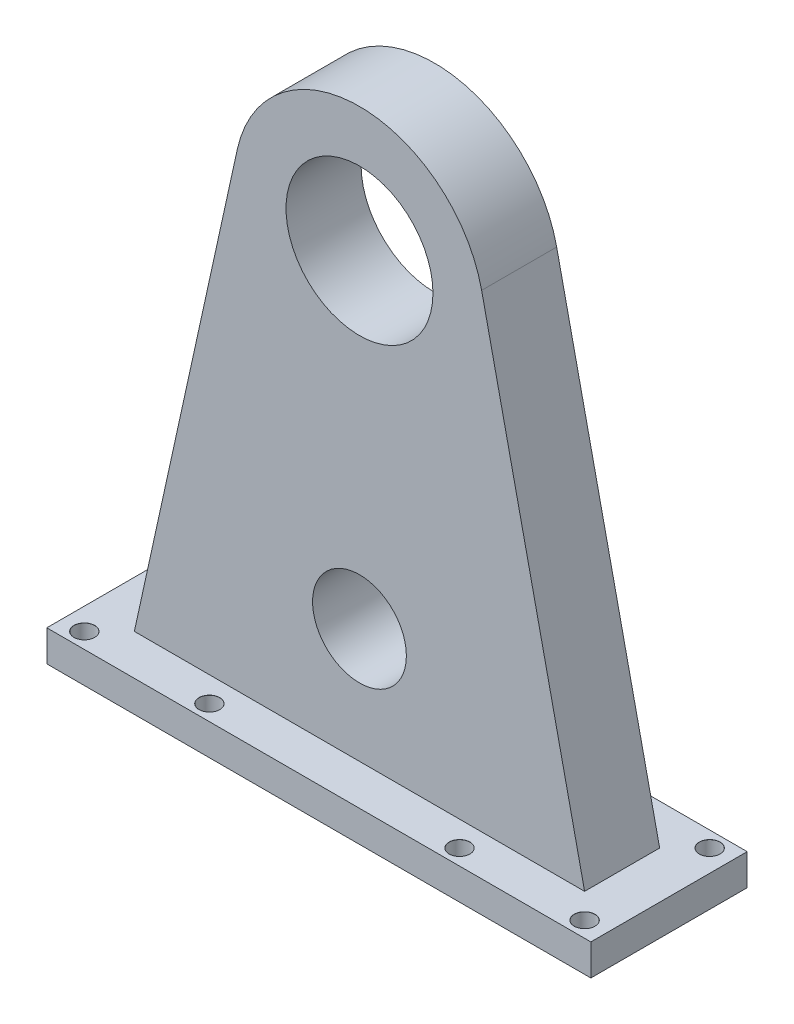
ISO-10303-21;
HEADER;
FILE_DESCRIPTION(('STEP AP214'),'2;1');
FILE_NAME('part.step','',(''),(''),'','','');
FILE_SCHEMA(('AUTOMOTIVE_DESIGN { 1 0 10303 214 1 1 1 1 }'));
ENDSEC;
DATA;
#1=APPLICATION_CONTEXT('core data for automotive mechanical design processes');
#2=APPLICATION_PROTOCOL_DEFINITION('international standard','automotive_design',2000,#1);
#3=PRODUCT_CONTEXT('',#1,'mechanical');
#4=PRODUCT('Part','Part','',(#3));
#5=PRODUCT_RELATED_PRODUCT_CATEGORY('part','',(#4));
#6=PRODUCT_DEFINITION_FORMATION('','',#4);
#7=PRODUCT_DEFINITION_CONTEXT('part definition',#1,'design');
#8=PRODUCT_DEFINITION('design','',#6,#7);
#9=PRODUCT_DEFINITION_SHAPE('','',#8);
#10=(LENGTH_UNIT() NAMED_UNIT(*) SI_UNIT(.MILLI.,.METRE.));
#11=(NAMED_UNIT(*) PLANE_ANGLE_UNIT() SI_UNIT($,.RADIAN.));
#12=(NAMED_UNIT(*) SI_UNIT($,.STERADIAN.) SOLID_ANGLE_UNIT());
#13=UNCERTAINTY_MEASURE_WITH_UNIT(LENGTH_MEASURE(1.E-05),#10,'distance_accuracy_value','');
#14=(GEOMETRIC_REPRESENTATION_CONTEXT(3) GLOBAL_UNCERTAINTY_ASSIGNED_CONTEXT((#13)) GLOBAL_UNIT_ASSIGNED_CONTEXT((#10,
#11,#12)) REPRESENTATION_CONTEXT('',''));
#15=CARTESIAN_POINT('',(0.,0.,0.));
#16=DIRECTION('',(0.,0.,1.));
#17=DIRECTION('',(1.,0.,0.));
#18=AXIS2_PLACEMENT_3D('',#15,#16,#17);
#19=CARTESIAN_POINT('',(87.,10.,-25.));
#20=DIRECTION('',(-1.,0.,0.));
#21=DIRECTION('',(0.,0.,1.));
#22=AXIS2_PLACEMENT_3D('',#19,#20,#21);
#23=PLANE('',#22);
#24=DIRECTION('',(0.,0.,-1.));
#25=VECTOR('',#24,1.);
#26=CARTESIAN_POINT('',(87.,0.,-25.));
#27=LINE('',#26,#25);
#28=CARTESIAN_POINT('',(87.,0.,25.));
#29=VERTEX_POINT('',#28);
#30=CARTESIAN_POINT('',(87.,0.,-25.));
#31=VERTEX_POINT('',#30);
#32=EDGE_CURVE('E247',#29,#31,#27,.T.);
#33=ORIENTED_EDGE('',*,*,#32,.T.);
#34=DIRECTION('',(0.,-1.,0.));
#35=VECTOR('',#34,1.);
#36=CARTESIAN_POINT('',(87.,10.,-25.));
#37=LINE('',#36,#35);
#38=CARTESIAN_POINT('',(87.,10.,-25.));
#39=VERTEX_POINT('',#38);
#40=EDGE_CURVE('E11',#39,#31,#37,.T.);
#41=ORIENTED_EDGE('',*,*,#40,.F.);
#42=DIRECTION('',(0.,0.,-1.));
#43=VECTOR('',#42,1.);
#44=CARTESIAN_POINT('',(87.,10.,-25.));
#45=LINE('',#44,#43);
#46=CARTESIAN_POINT('',(87.,10.,25.));
#47=VERTEX_POINT('',#46);
#48=EDGE_CURVE('E248',#47,#39,#45,.T.);
#49=ORIENTED_EDGE('',*,*,#48,.F.);
#50=DIRECTION('',(0.,-1.,0.));
#51=VECTOR('',#50,1.);
#52=CARTESIAN_POINT('',(87.,10.,25.));
#53=LINE('',#52,#51);
#54=EDGE_CURVE('E258',#47,#29,#53,.T.);
#55=ORIENTED_EDGE('',*,*,#54,.T.);
#56=EDGE_LOOP('',(#33,#41,#49,#55));
#57=FACE_BOUND('',#56,.T.);
#58=ADVANCED_FACE('F43',(#57),#23,.F.);
#59=CARTESIAN_POINT('',(-87.,10.,-25.));
#60=DIRECTION('',(0.,0.,1.));
#61=DIRECTION('',(1.,0.,0.));
#62=AXIS2_PLACEMENT_3D('',#59,#60,#61);
#63=PLANE('',#62);
#64=DIRECTION('',(-1.,0.,0.));
#65=VECTOR('',#64,1.);
#66=CARTESIAN_POINT('',(-87.,0.,-25.));
#67=LINE('',#66,#65);
#68=CARTESIAN_POINT('',(-87.,0.,-25.));
#69=VERTEX_POINT('',#68);
#70=EDGE_CURVE('E262',#31,#69,#67,.T.);
#71=ORIENTED_EDGE('',*,*,#70,.T.);
#72=DIRECTION('',(0.,-1.,0.));
#73=VECTOR('',#72,1.);
#74=CARTESIAN_POINT('',(-87.,10.,-25.));
#75=LINE('',#74,#73);
#76=CARTESIAN_POINT('',(-87.,10.,-25.));
#77=VERTEX_POINT('',#76);
#78=EDGE_CURVE('E51',#77,#69,#75,.T.);
#79=ORIENTED_EDGE('',*,*,#78,.F.);
#80=DIRECTION('',(-1.,0.,0.));
#81=VECTOR('',#80,1.);
#82=CARTESIAN_POINT('',(-87.,10.,-25.));
#83=LINE('',#82,#81);
#84=EDGE_CURVE('E95',#39,#77,#83,.T.);
#85=ORIENTED_EDGE('',*,*,#84,.F.);
#86=ORIENTED_EDGE('',*,*,#40,.T.);
#87=EDGE_LOOP('',(#71,#79,#85,#86));
#88=FACE_BOUND('',#87,.T.);
#89=ADVANCED_FACE('F295',(#88),#63,.F.);
#90=CARTESIAN_POINT('',(-87.,10.,-25.));
#91=DIRECTION('',(1.,0.,0.));
#92=DIRECTION('',(0.,0.,-1.));
#93=AXIS2_PLACEMENT_3D('',#90,#91,#92);
#94=PLANE('',#93);
#95=DIRECTION('',(0.,0.,1.));
#96=VECTOR('',#95,1.);
#97=CARTESIAN_POINT('',(-87.,0.,-25.));
#98=LINE('',#97,#96);
#99=CARTESIAN_POINT('',(-87.,0.,25.));
#100=VERTEX_POINT('',#99);
#101=EDGE_CURVE('E265',#69,#100,#98,.T.);
#102=ORIENTED_EDGE('',*,*,#101,.T.);
#103=DIRECTION('',(0.,-1.,0.));
#104=VECTOR('',#103,1.);
#105=CARTESIAN_POINT('',(-87.,10.,25.));
#106=LINE('',#105,#104);
#107=CARTESIAN_POINT('',(-87.,10.,25.));
#108=VERTEX_POINT('',#107);
#109=EDGE_CURVE('E272',#108,#100,#106,.T.);
#110=ORIENTED_EDGE('',*,*,#109,.F.);
#111=DIRECTION('',(0.,0.,1.));
#112=VECTOR('',#111,1.);
#113=CARTESIAN_POINT('',(-87.,10.,-25.));
#114=LINE('',#113,#112);
#115=EDGE_CURVE('E253',#77,#108,#114,.T.);
#116=ORIENTED_EDGE('',*,*,#115,.F.);
#117=ORIENTED_EDGE('',*,*,#78,.T.);
#118=EDGE_LOOP('',(#102,#110,#116,#117));
#119=FACE_BOUND('',#118,.T.);
#120=ADVANCED_FACE('F279',(#119),#94,.F.);
#121=CARTESIAN_POINT('',(-87.,10.,25.));
#122=DIRECTION('',(0.,0.,-1.));
#123=DIRECTION('',(-1.,0.,0.));
#124=AXIS2_PLACEMENT_3D('',#121,#122,#123);
#125=PLANE('',#124);
#126=DIRECTION('',(1.,0.,0.));
#127=VECTOR('',#126,1.);
#128=CARTESIAN_POINT('',(-87.,0.,25.));
#129=LINE('',#128,#127);
#130=EDGE_CURVE('E88',#100,#29,#129,.T.);
#131=ORIENTED_EDGE('',*,*,#130,.T.);
#132=ORIENTED_EDGE('',*,*,#54,.F.);
#133=DIRECTION('',(1.,0.,0.));
#134=VECTOR('',#133,1.);
#135=CARTESIAN_POINT('',(-87.,10.,25.));
#136=LINE('',#135,#134);
#137=EDGE_CURVE('E67',#108,#47,#136,.T.);
#138=ORIENTED_EDGE('',*,*,#137,.F.);
#139=ORIENTED_EDGE('',*,*,#109,.T.);
#140=EDGE_LOOP('',(#131,#132,#138,#139));
#141=FACE_BOUND('',#140,.T.);
#142=ADVANCED_FACE('F287',(#141),#125,.F.);
#143=CARTESIAN_POINT('',(0.,10.,0.));
#144=DIRECTION('',(0.,1.,0.));
#145=DIRECTION('',(0.,0.,1.));
#146=AXIS2_PLACEMENT_3D('',#143,#144,#145);
#147=PLANE('',#146);
#148=DIRECTION('',(1.,0.,0.));
#149=VECTOR('',#148,1.);
#150=CARTESIAN_POINT('',(-72.,10.,-12.));
#151=LINE('',#150,#149);
#152=CARTESIAN_POINT('',(-72.,10.,-12.));
#153=VERTEX_POINT('',#152);
#154=CARTESIAN_POINT('',(72.,10.,-12.));
#155=VERTEX_POINT('',#154);
#156=EDGE_CURVE('E139',#153,#155,#151,.T.);
#157=ORIENTED_EDGE('',*,*,#156,.T.);
#158=DIRECTION('',(0.,0.,1.));
#159=VECTOR('',#158,1.);
#160=CARTESIAN_POINT('',(72.,10.,-12.));
#161=LINE('',#160,#159);
#162=CARTESIAN_POINT('',(72.,10.,12.));
#163=VERTEX_POINT('',#162);
#164=EDGE_CURVE('E130',#155,#163,#161,.T.);
#165=ORIENTED_EDGE('',*,*,#164,.T.);
#166=DIRECTION('',(1.,0.,0.));
#167=VECTOR('',#166,1.);
#168=CARTESIAN_POINT('',(-72.,10.,12.));
#169=LINE('',#168,#167);
#170=CARTESIAN_POINT('',(-72.,10.,12.));
#171=VERTEX_POINT('',#170);
#172=EDGE_CURVE('E117',#171,#163,#169,.T.);
#173=ORIENTED_EDGE('',*,*,#172,.F.);
#174=DIRECTION('',(0.,0.,1.));
#175=VECTOR('',#174,1.);
#176=CARTESIAN_POINT('',(-72.,10.,-12.));
#177=LINE('',#176,#175);
#178=EDGE_CURVE('E141',#153,#171,#177,.T.);
#179=ORIENTED_EDGE('',*,*,#178,.F.);
#180=EDGE_LOOP('',(#157,#165,#173,#179));
#181=FACE_BOUND('',#180,.T.);
#182=CARTESIAN_POINT('',(-80.,10.,-20.));
#183=DIRECTION('',(0.,1.,0.));
#184=DIRECTION('',(0.,0.,1.));
#185=AXIS2_PLACEMENT_3D('',#182,#183,#184);
#186=CIRCLE('',#185,3.32499999999999);
#187=CARTESIAN_POINT('',(-80.,10.,-16.675));
#188=VERTEX_POINT('',#187);
#189=EDGE_CURVE('E151',#188,#188,#186,.T.);
#190=ORIENTED_EDGE('',*,*,#189,.F.);
#191=EDGE_LOOP('',(#190));
#192=FACE_BOUND('',#191,.T.);
#193=CARTESIAN_POINT('',(-40.,10.,-20.));
#194=DIRECTION('',(0.,1.,0.));
#195=DIRECTION('',(0.,0.,1.));
#196=AXIS2_PLACEMENT_3D('',#193,#194,#195);
#197=CIRCLE('',#196,3.325);
#198=CARTESIAN_POINT('',(-40.,10.,-16.675));
#199=VERTEX_POINT('',#198);
#200=EDGE_CURVE('E163',#199,#199,#197,.T.);
#201=ORIENTED_EDGE('',*,*,#200,.F.);
#202=EDGE_LOOP('',(#201));
#203=FACE_BOUND('',#202,.T.);
#204=CARTESIAN_POINT('',(-80.,10.,20.));
#205=DIRECTION('',(0.,1.,0.));
#206=DIRECTION('',(0.,0.,1.));
#207=AXIS2_PLACEMENT_3D('',#204,#205,#206);
#208=CIRCLE('',#207,3.32499999999999);
#209=CARTESIAN_POINT('',(-80.,10.,23.325));
#210=VERTEX_POINT('',#209);
#211=EDGE_CURVE('E175',#210,#210,#208,.T.);
#212=ORIENTED_EDGE('',*,*,#211,.F.);
#213=EDGE_LOOP('',(#212));
#214=FACE_BOUND('',#213,.T.);
#215=CARTESIAN_POINT('',(-40.,10.,20.));
#216=DIRECTION('',(0.,1.,0.));
#217=DIRECTION('',(0.,0.,1.));
#218=AXIS2_PLACEMENT_3D('',#215,#216,#217);
#219=CIRCLE('',#218,3.325);
#220=CARTESIAN_POINT('',(-40.,10.,23.325));
#221=VERTEX_POINT('',#220);
#222=EDGE_CURVE('E187',#221,#221,#219,.T.);
#223=ORIENTED_EDGE('',*,*,#222,.F.);
#224=EDGE_LOOP('',(#223));
#225=FACE_BOUND('',#224,.T.);
#226=CARTESIAN_POINT('',(40.,10.,-20.));
#227=DIRECTION('',(0.,1.,0.));
#228=DIRECTION('',(0.,0.,1.));
#229=AXIS2_PLACEMENT_3D('',#226,#227,#228);
#230=CIRCLE('',#229,3.325);
#231=CARTESIAN_POINT('',(40.,10.,-16.675));
#232=VERTEX_POINT('',#231);
#233=EDGE_CURVE('E199',#232,#232,#230,.T.);
#234=ORIENTED_EDGE('',*,*,#233,.F.);
#235=EDGE_LOOP('',(#234));
#236=FACE_BOUND('',#235,.T.);
#237=CARTESIAN_POINT('',(80.,10.,-20.));
#238=DIRECTION('',(0.,1.,0.));
#239=DIRECTION('',(0.,0.,1.));
#240=AXIS2_PLACEMENT_3D('',#237,#238,#239);
#241=CIRCLE('',#240,3.32499999999999);
#242=CARTESIAN_POINT('',(80.,10.,-16.675));
#243=VERTEX_POINT('',#242);
#244=EDGE_CURVE('E211',#243,#243,#241,.T.);
#245=ORIENTED_EDGE('',*,*,#244,.F.);
#246=EDGE_LOOP('',(#245));
#247=FACE_BOUND('',#246,.T.);
#248=CARTESIAN_POINT('',(40.,10.,20.));
#249=DIRECTION('',(0.,1.,0.));
#250=DIRECTION('',(0.,0.,1.));
#251=AXIS2_PLACEMENT_3D('',#248,#249,#250);
#252=CIRCLE('',#251,3.325);
#253=CARTESIAN_POINT('',(40.,10.,23.325));
#254=VERTEX_POINT('',#253);
#255=EDGE_CURVE('E223',#254,#254,#252,.T.);
#256=ORIENTED_EDGE('',*,*,#255,.F.);
#257=EDGE_LOOP('',(#256));
#258=FACE_BOUND('',#257,.T.);
#259=CARTESIAN_POINT('',(80.,10.,20.));
#260=DIRECTION('',(0.,1.,0.));
#261=DIRECTION('',(0.,0.,1.));
#262=AXIS2_PLACEMENT_3D('',#259,#260,#261);
#263=CIRCLE('',#262,3.32499999999999);
#264=CARTESIAN_POINT('',(80.,10.,23.325));
#265=VERTEX_POINT('',#264);
#266=EDGE_CURVE('E235',#265,#265,#263,.T.);
#267=ORIENTED_EDGE('',*,*,#266,.F.);
#268=EDGE_LOOP('',(#267));
#269=FACE_BOUND('',#268,.T.);
#270=ORIENTED_EDGE('',*,*,#48,.T.);
#271=ORIENTED_EDGE('',*,*,#84,.T.);
#272=ORIENTED_EDGE('',*,*,#115,.T.);
#273=ORIENTED_EDGE('',*,*,#137,.T.);
#274=EDGE_LOOP('',(#270,#271,#272,#273));
#275=FACE_BOUND('',#274,.T.);
#276=ADVANCED_FACE('F137',(#181,#192,#203,#214,#225,#236,#247,#258,#269,#275),#147,.T.);
#277=CARTESIAN_POINT('',(0.,0.,0.));
#278=DIRECTION('',(0.,1.,0.));
#279=DIRECTION('',(0.,0.,1.));
#280=AXIS2_PLACEMENT_3D('',#277,#278,#279);
#281=PLANE('',#280);
#282=CARTESIAN_POINT('',(-80.,0.,-20.));
#283=DIRECTION('',(0.,1.,0.));
#284=DIRECTION('',(0.,0.,1.));
#285=AXIS2_PLACEMENT_3D('',#282,#283,#284);
#286=CIRCLE('',#285,3.3);
#287=CARTESIAN_POINT('',(-80.,0.,-16.7));
#288=VERTEX_POINT('',#287);
#289=EDGE_CURVE('E159',#288,#288,#286,.T.);
#290=ORIENTED_EDGE('',*,*,#289,.T.);
#291=EDGE_LOOP('',(#290));
#292=FACE_BOUND('',#291,.T.);
#293=CARTESIAN_POINT('',(-40.,0.,-20.));
#294=DIRECTION('',(0.,1.,0.));
#295=DIRECTION('',(0.,0.,1.));
#296=AXIS2_PLACEMENT_3D('',#293,#294,#295);
#297=CIRCLE('',#296,3.3);
#298=CARTESIAN_POINT('',(-40.,0.,-16.7));
#299=VERTEX_POINT('',#298);
#300=EDGE_CURVE('E171',#299,#299,#297,.T.);
#301=ORIENTED_EDGE('',*,*,#300,.T.);
#302=EDGE_LOOP('',(#301));
#303=FACE_BOUND('',#302,.T.);
#304=CARTESIAN_POINT('',(-80.,0.,20.));
#305=DIRECTION('',(0.,1.,0.));
#306=DIRECTION('',(0.,0.,1.));
#307=AXIS2_PLACEMENT_3D('',#304,#305,#306);
#308=CIRCLE('',#307,3.3);
#309=CARTESIAN_POINT('',(-80.,0.,23.3));
#310=VERTEX_POINT('',#309);
#311=EDGE_CURVE('E183',#310,#310,#308,.T.);
#312=ORIENTED_EDGE('',*,*,#311,.T.);
#313=EDGE_LOOP('',(#312));
#314=FACE_BOUND('',#313,.T.);
#315=CARTESIAN_POINT('',(-40.,0.,20.));
#316=DIRECTION('',(0.,1.,0.));
#317=DIRECTION('',(0.,0.,1.));
#318=AXIS2_PLACEMENT_3D('',#315,#316,#317);
#319=CIRCLE('',#318,3.3);
#320=CARTESIAN_POINT('',(-40.,0.,23.3));
#321=VERTEX_POINT('',#320);
#322=EDGE_CURVE('E195',#321,#321,#319,.T.);
#323=ORIENTED_EDGE('',*,*,#322,.T.);
#324=EDGE_LOOP('',(#323));
#325=FACE_BOUND('',#324,.T.);
#326=CARTESIAN_POINT('',(40.,0.,-20.));
#327=DIRECTION('',(0.,1.,0.));
#328=DIRECTION('',(0.,0.,1.));
#329=AXIS2_PLACEMENT_3D('',#326,#327,#328);
#330=CIRCLE('',#329,3.3);
#331=CARTESIAN_POINT('',(40.,0.,-16.7));
#332=VERTEX_POINT('',#331);
#333=EDGE_CURVE('E207',#332,#332,#330,.T.);
#334=ORIENTED_EDGE('',*,*,#333,.T.);
#335=EDGE_LOOP('',(#334));
#336=FACE_BOUND('',#335,.T.);
#337=CARTESIAN_POINT('',(80.,0.,-20.));
#338=DIRECTION('',(0.,1.,0.));
#339=DIRECTION('',(0.,0.,1.));
#340=AXIS2_PLACEMENT_3D('',#337,#338,#339);
#341=CIRCLE('',#340,3.3);
#342=CARTESIAN_POINT('',(80.,0.,-16.7));
#343=VERTEX_POINT('',#342);
#344=EDGE_CURVE('E219',#343,#343,#341,.T.);
#345=ORIENTED_EDGE('',*,*,#344,.T.);
#346=EDGE_LOOP('',(#345));
#347=FACE_BOUND('',#346,.T.);
#348=CARTESIAN_POINT('',(40.,0.,20.));
#349=DIRECTION('',(0.,1.,0.));
#350=DIRECTION('',(0.,0.,1.));
#351=AXIS2_PLACEMENT_3D('',#348,#349,#350);
#352=CIRCLE('',#351,3.3);
#353=CARTESIAN_POINT('',(40.,0.,23.3));
#354=VERTEX_POINT('',#353);
#355=EDGE_CURVE('E231',#354,#354,#352,.T.);
#356=ORIENTED_EDGE('',*,*,#355,.T.);
#357=EDGE_LOOP('',(#356));
#358=FACE_BOUND('',#357,.T.);
#359=CARTESIAN_POINT('',(80.,0.,20.));
#360=DIRECTION('',(0.,1.,0.));
#361=DIRECTION('',(0.,0.,1.));
#362=AXIS2_PLACEMENT_3D('',#359,#360,#361);
#363=CIRCLE('',#362,3.3);
#364=CARTESIAN_POINT('',(80.,0.,23.3));
#365=VERTEX_POINT('',#364);
#366=EDGE_CURVE('E243',#365,#365,#363,.T.);
#367=ORIENTED_EDGE('',*,*,#366,.T.);
#368=EDGE_LOOP('',(#367));
#369=FACE_BOUND('',#368,.T.);
#370=ORIENTED_EDGE('',*,*,#32,.F.);
#371=ORIENTED_EDGE('',*,*,#130,.F.);
#372=ORIENTED_EDGE('',*,*,#101,.F.);
#373=ORIENTED_EDGE('',*,*,#70,.F.);
#374=EDGE_LOOP('',(#370,#371,#372,#373));
#375=FACE_BOUND('',#374,.T.);
#376=ADVANCED_FACE('F283',(#292,#303,#314,#325,#336,#347,#358,#369,#375),#281,.F.);
#377=CARTESIAN_POINT('',(80.,10.,20.));
#378=DIRECTION('',(0.,1.,0.));
#379=DIRECTION('',(0.,0.,1.));
#380=AXIS2_PLACEMENT_3D('',#377,#378,#379);
#381=CYLINDRICAL_SURFACE('',#380,3.3);
#382=ORIENTED_EDGE('',*,*,#366,.F.);
#383=EDGE_LOOP('',(#382));
#384=FACE_BOUND('',#383,.T.);
#385=CARTESIAN_POINT('',(80.,9.97902250922056,20.));
#386=DIRECTION('',(0.,1.,0.));
#387=DIRECTION('',(0.,0.,1.));
#388=AXIS2_PLACEMENT_3D('',#385,#386,#387);
#389=CIRCLE('',#388,3.3);
#390=CARTESIAN_POINT('',(80.,9.97902250922056,23.3));
#391=VERTEX_POINT('',#390);
#392=EDGE_CURVE('E239',#391,#391,#389,.T.);
#393=ORIENTED_EDGE('',*,*,#392,.T.);
#394=EDGE_LOOP('',(#393));
#395=FACE_BOUND('',#394,.T.);
#396=ADVANCED_FACE('F324',(#384,#395),#381,.F.);
#397=CARTESIAN_POINT('',(80.,10.,20.));
#398=DIRECTION('',(0.,1.,0.));
#399=DIRECTION('',(0.,0.,1.));
#400=AXIS2_PLACEMENT_3D('',#397,#398,#399);
#401=CONICAL_SURFACE('',#400,3.32499999999999,0.87266462599705);
#402=ORIENTED_EDGE('',*,*,#392,.F.);
#403=EDGE_LOOP('',(#402));
#404=FACE_BOUND('',#403,.T.);
#405=ORIENTED_EDGE('',*,*,#266,.T.);
#406=EDGE_LOOP('',(#405));
#407=FACE_BOUND('',#406,.T.);
#408=ADVANCED_FACE('F334',(#404,#407),#401,.F.);
#409=CARTESIAN_POINT('',(40.,10.,20.));
#410=DIRECTION('',(0.,1.,0.));
#411=DIRECTION('',(0.,0.,1.));
#412=AXIS2_PLACEMENT_3D('',#409,#410,#411);
#413=CYLINDRICAL_SURFACE('',#412,3.3);
#414=ORIENTED_EDGE('',*,*,#355,.F.);
#415=EDGE_LOOP('',(#414));
#416=FACE_BOUND('',#415,.T.);
#417=CARTESIAN_POINT('',(40.,9.97902250922056,20.));
#418=DIRECTION('',(0.,1.,0.));
#419=DIRECTION('',(0.,0.,1.));
#420=AXIS2_PLACEMENT_3D('',#417,#418,#419);
#421=CIRCLE('',#420,3.3);
#422=CARTESIAN_POINT('',(40.,9.97902250922056,23.3));
#423=VERTEX_POINT('',#422);
#424=EDGE_CURVE('E227',#423,#423,#421,.T.);
#425=ORIENTED_EDGE('',*,*,#424,.T.);
#426=EDGE_LOOP('',(#425));
#427=FACE_BOUND('',#426,.T.);
#428=ADVANCED_FACE('F345',(#416,#427),#413,.F.);
#429=CARTESIAN_POINT('',(40.,10.,20.));
#430=DIRECTION('',(0.,1.,0.));
#431=DIRECTION('',(0.,0.,1.));
#432=AXIS2_PLACEMENT_3D('',#429,#430,#431);
#433=CONICAL_SURFACE('',#432,3.325,0.872664625997186);
#434=ORIENTED_EDGE('',*,*,#424,.F.);
#435=EDGE_LOOP('',(#434));
#436=FACE_BOUND('',#435,.T.);
#437=ORIENTED_EDGE('',*,*,#255,.T.);
#438=EDGE_LOOP('',(#437));
#439=FACE_BOUND('',#438,.T.);
#440=ADVANCED_FACE('F356',(#436,#439),#433,.F.);
#441=CARTESIAN_POINT('',(80.,10.,-20.));
#442=DIRECTION('',(0.,1.,0.));
#443=DIRECTION('',(0.,0.,1.));
#444=AXIS2_PLACEMENT_3D('',#441,#442,#443);
#445=CYLINDRICAL_SURFACE('',#444,3.3);
#446=ORIENTED_EDGE('',*,*,#344,.F.);
#447=EDGE_LOOP('',(#446));
#448=FACE_BOUND('',#447,.T.);
#449=CARTESIAN_POINT('',(80.,9.97902250922056,-20.));
#450=DIRECTION('',(0.,1.,0.));
#451=DIRECTION('',(0.,0.,1.));
#452=AXIS2_PLACEMENT_3D('',#449,#450,#451);
#453=CIRCLE('',#452,3.3);
#454=CARTESIAN_POINT('',(80.,9.97902250922056,-16.7));
#455=VERTEX_POINT('',#454);
#456=EDGE_CURVE('E215',#455,#455,#453,.T.);
#457=ORIENTED_EDGE('',*,*,#456,.T.);
#458=EDGE_LOOP('',(#457));
#459=FACE_BOUND('',#458,.T.);
#460=ADVANCED_FACE('F367',(#448,#459),#445,.F.);
#461=CARTESIAN_POINT('',(80.,10.,-20.));
#462=DIRECTION('',(0.,1.,0.));
#463=DIRECTION('',(0.,0.,1.));
#464=AXIS2_PLACEMENT_3D('',#461,#462,#463);
#465=CONICAL_SURFACE('',#464,3.32499999999999,0.87266462599705);
#466=ORIENTED_EDGE('',*,*,#456,.F.);
#467=EDGE_LOOP('',(#466));
#468=FACE_BOUND('',#467,.T.);
#469=ORIENTED_EDGE('',*,*,#244,.T.);
#470=EDGE_LOOP('',(#469));
#471=FACE_BOUND('',#470,.T.);
#472=ADVANCED_FACE('F378',(#468,#471),#465,.F.);
#473=CARTESIAN_POINT('',(40.,10.,-20.));
#474=DIRECTION('',(0.,1.,0.));
#475=DIRECTION('',(0.,0.,1.));
#476=AXIS2_PLACEMENT_3D('',#473,#474,#475);
#477=CYLINDRICAL_SURFACE('',#476,3.3);
#478=ORIENTED_EDGE('',*,*,#333,.F.);
#479=EDGE_LOOP('',(#478));
#480=FACE_BOUND('',#479,.T.);
#481=CARTESIAN_POINT('',(40.,9.97902250922056,-20.));
#482=DIRECTION('',(0.,1.,0.));
#483=DIRECTION('',(0.,0.,1.));
#484=AXIS2_PLACEMENT_3D('',#481,#482,#483);
#485=CIRCLE('',#484,3.3);
#486=CARTESIAN_POINT('',(40.,9.97902250922056,-16.7));
#487=VERTEX_POINT('',#486);
#488=EDGE_CURVE('E203',#487,#487,#485,.T.);
#489=ORIENTED_EDGE('',*,*,#488,.T.);
#490=EDGE_LOOP('',(#489));
#491=FACE_BOUND('',#490,.T.);
#492=ADVANCED_FACE('F389',(#480,#491),#477,.F.);
#493=CARTESIAN_POINT('',(40.,10.,-20.));
#494=DIRECTION('',(0.,1.,0.));
#495=DIRECTION('',(0.,0.,1.));
#496=AXIS2_PLACEMENT_3D('',#493,#494,#495);
#497=CONICAL_SURFACE('',#496,3.325,0.872664625997186);
#498=ORIENTED_EDGE('',*,*,#488,.F.);
#499=EDGE_LOOP('',(#498));
#500=FACE_BOUND('',#499,.T.);
#501=ORIENTED_EDGE('',*,*,#233,.T.);
#502=EDGE_LOOP('',(#501));
#503=FACE_BOUND('',#502,.T.);
#504=ADVANCED_FACE('F400',(#500,#503),#497,.F.);
#505=CARTESIAN_POINT('',(-40.,10.,20.));
#506=DIRECTION('',(0.,1.,0.));
#507=DIRECTION('',(0.,0.,1.));
#508=AXIS2_PLACEMENT_3D('',#505,#506,#507);
#509=CYLINDRICAL_SURFACE('',#508,3.3);
#510=ORIENTED_EDGE('',*,*,#322,.F.);
#511=EDGE_LOOP('',(#510));
#512=FACE_BOUND('',#511,.T.);
#513=CARTESIAN_POINT('',(-40.,9.97902250922056,20.));
#514=DIRECTION('',(0.,1.,0.));
#515=DIRECTION('',(0.,0.,1.));
#516=AXIS2_PLACEMENT_3D('',#513,#514,#515);
#517=CIRCLE('',#516,3.3);
#518=CARTESIAN_POINT('',(-40.,9.97902250922056,23.3));
#519=VERTEX_POINT('',#518);
#520=EDGE_CURVE('E191',#519,#519,#517,.T.);
#521=ORIENTED_EDGE('',*,*,#520,.T.);
#522=EDGE_LOOP('',(#521));
#523=FACE_BOUND('',#522,.T.);
#524=ADVANCED_FACE('F411',(#512,#523),#509,.F.);
#525=CARTESIAN_POINT('',(-40.,10.,20.));
#526=DIRECTION('',(0.,1.,0.));
#527=DIRECTION('',(0.,0.,1.));
#528=AXIS2_PLACEMENT_3D('',#525,#526,#527);
#529=CONICAL_SURFACE('',#528,3.325,0.872664625997186);
#530=ORIENTED_EDGE('',*,*,#520,.F.);
#531=EDGE_LOOP('',(#530));
#532=FACE_BOUND('',#531,.T.);
#533=ORIENTED_EDGE('',*,*,#222,.T.);
#534=EDGE_LOOP('',(#533));
#535=FACE_BOUND('',#534,.T.);
#536=ADVANCED_FACE('F422',(#532,#535),#529,.F.);
#537=CARTESIAN_POINT('',(-80.,10.,20.));
#538=DIRECTION('',(0.,1.,0.));
#539=DIRECTION('',(0.,0.,1.));
#540=AXIS2_PLACEMENT_3D('',#537,#538,#539);
#541=CYLINDRICAL_SURFACE('',#540,3.3);
#542=ORIENTED_EDGE('',*,*,#311,.F.);
#543=EDGE_LOOP('',(#542));
#544=FACE_BOUND('',#543,.T.);
#545=CARTESIAN_POINT('',(-80.,9.97902250922056,20.));
#546=DIRECTION('',(0.,1.,0.));
#547=DIRECTION('',(0.,0.,1.));
#548=AXIS2_PLACEMENT_3D('',#545,#546,#547);
#549=CIRCLE('',#548,3.3);
#550=CARTESIAN_POINT('',(-80.,9.97902250922056,23.3));
#551=VERTEX_POINT('',#550);
#552=EDGE_CURVE('E179',#551,#551,#549,.T.);
#553=ORIENTED_EDGE('',*,*,#552,.T.);
#554=EDGE_LOOP('',(#553));
#555=FACE_BOUND('',#554,.T.);
#556=ADVANCED_FACE('F433',(#544,#555),#541,.F.);
#557=CARTESIAN_POINT('',(-80.,10.,20.));
#558=DIRECTION('',(0.,1.,0.));
#559=DIRECTION('',(0.,0.,1.));
#560=AXIS2_PLACEMENT_3D('',#557,#558,#559);
#561=CONICAL_SURFACE('',#560,3.32499999999999,0.87266462599705);
#562=ORIENTED_EDGE('',*,*,#552,.F.);
#563=EDGE_LOOP('',(#562));
#564=FACE_BOUND('',#563,.T.);
#565=ORIENTED_EDGE('',*,*,#211,.T.);
#566=EDGE_LOOP('',(#565));
#567=FACE_BOUND('',#566,.T.);
#568=ADVANCED_FACE('F444',(#564,#567),#561,.F.);
#569=CARTESIAN_POINT('',(-40.,10.,-20.));
#570=DIRECTION('',(0.,1.,0.));
#571=DIRECTION('',(0.,0.,1.));
#572=AXIS2_PLACEMENT_3D('',#569,#570,#571);
#573=CYLINDRICAL_SURFACE('',#572,3.3);
#574=ORIENTED_EDGE('',*,*,#300,.F.);
#575=EDGE_LOOP('',(#574));
#576=FACE_BOUND('',#575,.T.);
#577=CARTESIAN_POINT('',(-40.,9.97902250922056,-20.));
#578=DIRECTION('',(0.,1.,0.));
#579=DIRECTION('',(0.,0.,1.));
#580=AXIS2_PLACEMENT_3D('',#577,#578,#579);
#581=CIRCLE('',#580,3.3);
#582=CARTESIAN_POINT('',(-40.,9.97902250922056,-16.7));
#583=VERTEX_POINT('',#582);
#584=EDGE_CURVE('E167',#583,#583,#581,.T.);
#585=ORIENTED_EDGE('',*,*,#584,.T.);
#586=EDGE_LOOP('',(#585));
#587=FACE_BOUND('',#586,.T.);
#588=ADVANCED_FACE('F455',(#576,#587),#573,.F.);
#589=CARTESIAN_POINT('',(-40.,10.,-20.));
#590=DIRECTION('',(0.,1.,0.));
#591=DIRECTION('',(0.,0.,1.));
#592=AXIS2_PLACEMENT_3D('',#589,#590,#591);
#593=CONICAL_SURFACE('',#592,3.325,0.872664625997186);
#594=ORIENTED_EDGE('',*,*,#584,.F.);
#595=EDGE_LOOP('',(#594));
#596=FACE_BOUND('',#595,.T.);
#597=ORIENTED_EDGE('',*,*,#200,.T.);
#598=EDGE_LOOP('',(#597));
#599=FACE_BOUND('',#598,.T.);
#600=ADVANCED_FACE('F466',(#596,#599),#593,.F.);
#601=CARTESIAN_POINT('',(-80.,10.,-20.));
#602=DIRECTION('',(0.,1.,0.));
#603=DIRECTION('',(0.,0.,1.));
#604=AXIS2_PLACEMENT_3D('',#601,#602,#603);
#605=CYLINDRICAL_SURFACE('',#604,3.3);
#606=ORIENTED_EDGE('',*,*,#289,.F.);
#607=EDGE_LOOP('',(#606));
#608=FACE_BOUND('',#607,.T.);
#609=CARTESIAN_POINT('',(-80.,9.97902250922056,-20.));
#610=DIRECTION('',(0.,1.,0.));
#611=DIRECTION('',(0.,0.,1.));
#612=AXIS2_PLACEMENT_3D('',#609,#610,#611);
#613=CIRCLE('',#612,3.3);
#614=CARTESIAN_POINT('',(-80.,9.97902250922056,-16.7));
#615=VERTEX_POINT('',#614);
#616=EDGE_CURVE('E155',#615,#615,#613,.T.);
#617=ORIENTED_EDGE('',*,*,#616,.T.);
#618=EDGE_LOOP('',(#617));
#619=FACE_BOUND('',#618,.T.);
#620=ADVANCED_FACE('F477',(#608,#619),#605,.F.);
#621=CARTESIAN_POINT('',(-80.,10.,-20.));
#622=DIRECTION('',(0.,1.,0.));
#623=DIRECTION('',(0.,0.,1.));
#624=AXIS2_PLACEMENT_3D('',#621,#622,#623);
#625=CONICAL_SURFACE('',#624,3.32499999999999,0.87266462599705);
#626=ORIENTED_EDGE('',*,*,#616,.F.);
#627=EDGE_LOOP('',(#626));
#628=FACE_BOUND('',#627,.T.);
#629=ORIENTED_EDGE('',*,*,#189,.T.);
#630=EDGE_LOOP('',(#629));
#631=FACE_BOUND('',#630,.T.);
#632=ADVANCED_FACE('F488',(#628,#631),#625,.F.);
#633=CARTESIAN_POINT('',(-39.0695777305721,160.,-12.));
#634=DIRECTION('',(-0.976739443264302,0.214429615425996,0.));
#635=DIRECTION('',(-0.214429615425996,-0.976739443264302,0.));
#636=AXIS2_PLACEMENT_3D('',#633,#634,#635);
#637=PLANE('',#636);
#638=ORIENTED_EDGE('',*,*,#178,.T.);
#639=DIRECTION('',(-0.214429615425996,-0.976739443264303,0.));
#640=VECTOR('',#639,1.);
#641=CARTESIAN_POINT('',(-39.0695777305721,160.,12.));
#642=LINE('',#641,#640);
#643=CARTESIAN_POINT('',(-39.0695777305721,160.,12.));
#644=VERTEX_POINT('',#643);
#645=EDGE_CURVE('E58',#644,#171,#642,.T.);
#646=ORIENTED_EDGE('',*,*,#645,.F.);
#647=DIRECTION('',(0.,0.,1.));
#648=VECTOR('',#647,1.);
#649=CARTESIAN_POINT('',(-39.0695777305721,160.,-12.));
#650=LINE('',#649,#648);
#651=CARTESIAN_POINT('',(-39.0695777305721,160.,-12.));
#652=VERTEX_POINT('',#651);
#653=EDGE_CURVE('E145',#652,#644,#650,.T.);
#654=ORIENTED_EDGE('',*,*,#653,.F.);
#655=DIRECTION('',(-0.214429615425996,-0.976739443264303,0.));
#656=VECTOR('',#655,1.);
#657=CARTESIAN_POINT('',(-39.0695777305721,160.,-12.));
#658=LINE('',#657,#656);
#659=EDGE_CURVE('E645',#652,#153,#658,.T.);
#660=ORIENTED_EDGE('',*,*,#659,.T.);
#661=EDGE_LOOP('',(#638,#646,#654,#660));
#662=FACE_BOUND('',#661,.T.);
#663=ADVANCED_FACE('F499',(#662),#637,.T.);
#664=CARTESIAN_POINT('',(0.,151.42281538296,-12.));
#665=DIRECTION('',(0.,0.,1.));
#666=DIRECTION('',(1.,0.,0.));
#667=AXIS2_PLACEMENT_3D('',#664,#665,#666);
#668=CYLINDRICAL_SURFACE('',#667,40.);
#669=ORIENTED_EDGE('',*,*,#653,.T.);
#670=CARTESIAN_POINT('',(0.,151.42281538296,12.));
#671=DIRECTION('',(0.,0.,1.));
#672=DIRECTION('',(-1.,0.,0.));
#673=AXIS2_PLACEMENT_3D('',#670,#671,#672);
#674=CIRCLE('',#673,40.);
#675=CARTESIAN_POINT('',(39.0695777305721,160.,12.));
#676=VERTEX_POINT('',#675);
#677=EDGE_CURVE('E134',#676,#644,#674,.T.);
#678=ORIENTED_EDGE('',*,*,#677,.F.);
#679=DIRECTION('',(0.,0.,1.));
#680=VECTOR('',#679,1.);
#681=CARTESIAN_POINT('',(39.0695777305721,160.,-12.));
#682=LINE('',#681,#680);
#683=CARTESIAN_POINT('',(39.0695777305721,160.,-12.));
#684=VERTEX_POINT('',#683);
#685=EDGE_CURVE('E132',#684,#676,#682,.T.);
#686=ORIENTED_EDGE('',*,*,#685,.F.);
#687=CARTESIAN_POINT('',(0.,151.42281538296,-12.));
#688=DIRECTION('',(0.,0.,1.));
#689=DIRECTION('',(-1.,0.,0.));
#690=AXIS2_PLACEMENT_3D('',#687,#688,#689);
#691=CIRCLE('',#690,40.);
#692=EDGE_CURVE('E147',#684,#652,#691,.T.);
#693=ORIENTED_EDGE('',*,*,#692,.T.);
#694=EDGE_LOOP('',(#669,#678,#686,#693));
#695=FACE_BOUND('',#694,.T.);
#696=ADVANCED_FACE('F516',(#695),#668,.T.);
#697=CARTESIAN_POINT('',(72.,10.,-12.));
#698=DIRECTION('',(0.976739443264302,0.214429615425996,0.));
#699=DIRECTION('',(-0.214429615425996,0.976739443264302,0.));
#700=AXIS2_PLACEMENT_3D('',#697,#698,#699);
#701=PLANE('',#700);
#702=ORIENTED_EDGE('',*,*,#685,.T.);
#703=DIRECTION('',(-0.214429615425996,0.976739443264303,0.));
#704=VECTOR('',#703,1.);
#705=CARTESIAN_POINT('',(72.,10.,12.));
#706=LINE('',#705,#704);
#707=EDGE_CURVE('E120',#163,#676,#706,.T.);
#708=ORIENTED_EDGE('',*,*,#707,.F.);
#709=ORIENTED_EDGE('',*,*,#164,.F.);
#710=DIRECTION('',(-0.214429615425996,0.976739443264303,0.));
#711=VECTOR('',#710,1.);
#712=CARTESIAN_POINT('',(72.,10.,-12.));
#713=LINE('',#712,#711);
#714=EDGE_CURVE('E651',#155,#684,#713,.T.);
#715=ORIENTED_EDGE('',*,*,#714,.T.);
#716=EDGE_LOOP('',(#702,#708,#709,#715));
#717=FACE_BOUND('',#716,.T.);
#718=ADVANCED_FACE('F128',(#717),#701,.T.);
#719=CARTESIAN_POINT('',(0.,151.42281538296,-12.));
#720=DIRECTION('',(0.,0.,-1.));
#721=DIRECTION('',(-1.,0.,0.));
#722=AXIS2_PLACEMENT_3D('',#719,#720,#721);
#723=PLANE('',#722);
#724=CARTESIAN_POINT('',(0.,46.7228153829602,-12.));
#725=DIRECTION('',(0.,0.,-1.));
#726=DIRECTION('',(-1.,0.,0.));
#727=AXIS2_PLACEMENT_3D('',#724,#725,#726);
#728=CIRCLE('',#727,15.);
#729=CARTESIAN_POINT('',(-15.,46.7228153829602,-12.));
#730=VERTEX_POINT('',#729);
#731=EDGE_CURVE('E624',#730,#730,#728,.F.);
#732=ORIENTED_EDGE('',*,*,#731,.T.);
#733=EDGE_LOOP('',(#732));
#734=FACE_BOUND('',#733,.T.);
#735=CARTESIAN_POINT('',(0.,151.42281538296,-12.));
#736=DIRECTION('',(0.,0.,-1.));
#737=DIRECTION('',(-1.,0.,0.));
#738=AXIS2_PLACEMENT_3D('',#735,#736,#737);
#739=CIRCLE('',#738,23.5);
#740=CARTESIAN_POINT('',(-23.5,151.42281538296,-12.));
#741=VERTEX_POINT('',#740);
#742=EDGE_CURVE('E633',#741,#741,#739,.F.);
#743=ORIENTED_EDGE('',*,*,#742,.T.);
#744=EDGE_LOOP('',(#743));
#745=FACE_BOUND('',#744,.T.);
#746=ORIENTED_EDGE('',*,*,#659,.F.);
#747=ORIENTED_EDGE('',*,*,#692,.F.);
#748=ORIENTED_EDGE('',*,*,#714,.F.);
#749=ORIENTED_EDGE('',*,*,#156,.F.);
#750=EDGE_LOOP('',(#746,#747,#748,#749));
#751=FACE_BOUND('',#750,.T.);
#752=ADVANCED_FACE('F537',(#734,#745,#751),#723,.T.);
#753=CARTESIAN_POINT('',(0.,151.42281538296,12.));
#754=DIRECTION('',(0.,0.,-1.));
#755=DIRECTION('',(-1.,0.,0.));
#756=AXIS2_PLACEMENT_3D('',#753,#754,#755);
#757=PLANE('',#756);
#758=CARTESIAN_POINT('',(0.,46.7228153829602,12.));
#759=DIRECTION('',(0.,0.,1.));
#760=DIRECTION('',(1.,0.,0.));
#761=AXIS2_PLACEMENT_3D('',#758,#759,#760);
#762=CIRCLE('',#761,15.);
#763=CARTESIAN_POINT('',(15.,46.7228153829602,12.));
#764=VERTEX_POINT('',#763);
#765=EDGE_CURVE('E627',#764,#764,#762,.T.);
#766=ORIENTED_EDGE('',*,*,#765,.F.);
#767=EDGE_LOOP('',(#766));
#768=FACE_BOUND('',#767,.T.);
#769=CARTESIAN_POINT('',(0.,151.42281538296,12.));
#770=DIRECTION('',(0.,0.,1.));
#771=DIRECTION('',(1.,0.,0.));
#772=AXIS2_PLACEMENT_3D('',#769,#770,#771);
#773=CIRCLE('',#772,23.5);
#774=CARTESIAN_POINT('',(23.5,151.42281538296,12.));
#775=VERTEX_POINT('',#774);
#776=EDGE_CURVE('E639',#775,#775,#773,.T.);
#777=ORIENTED_EDGE('',*,*,#776,.F.);
#778=EDGE_LOOP('',(#777));
#779=FACE_BOUND('',#778,.T.);
#780=ORIENTED_EDGE('',*,*,#645,.T.);
#781=ORIENTED_EDGE('',*,*,#172,.T.);
#782=ORIENTED_EDGE('',*,*,#707,.T.);
#783=ORIENTED_EDGE('',*,*,#677,.T.);
#784=EDGE_LOOP('',(#780,#781,#782,#783));
#785=FACE_BOUND('',#784,.T.);
#786=ADVANCED_FACE('F119',(#768,#779,#785),#757,.F.);
#787=CARTESIAN_POINT('',(0.,151.42281538296,-25.001));
#788=DIRECTION('',(0.,0.,1.));
#789=DIRECTION('',(1.,0.,0.));
#790=AXIS2_PLACEMENT_3D('',#787,#788,#789);
#791=CYLINDRICAL_SURFACE('',#790,23.5);
#792=ORIENTED_EDGE('',*,*,#742,.F.);
#793=EDGE_LOOP('',(#792));
#794=FACE_BOUND('',#793,.T.);
#795=ORIENTED_EDGE('',*,*,#776,.T.);
#796=EDGE_LOOP('',(#795));
#797=FACE_BOUND('',#796,.T.);
#798=ADVANCED_FACE('F557',(#794,#797),#791,.F.);
#799=CARTESIAN_POINT('',(0.,46.7228153829602,-25.001));
#800=DIRECTION('',(0.,0.,1.));
#801=DIRECTION('',(1.,0.,0.));
#802=AXIS2_PLACEMENT_3D('',#799,#800,#801);
#803=CYLINDRICAL_SURFACE('',#802,15.);
#804=ORIENTED_EDGE('',*,*,#731,.F.);
#805=EDGE_LOOP('',(#804));
#806=FACE_BOUND('',#805,.T.);
#807=ORIENTED_EDGE('',*,*,#765,.T.);
#808=EDGE_LOOP('',(#807));
#809=FACE_BOUND('',#808,.T.);
#810=ADVANCED_FACE('F568',(#806,#809),#803,.F.);
#811=CLOSED_SHELL('',(#58,#89,#120,#142,#276,#376,#396,#408,#428,#440,#460,#472,#492,#504,#524,
#536,#556,#568,#588,#600,#620,#632,#663,#696,#718,#752,#786,#798,#810));
#812=MANIFOLD_SOLID_BREP('B2',#811);
#813=ADVANCED_BREP_SHAPE_REPRESENTATION('',(#18,#812),#14);
#814=SHAPE_DEFINITION_REPRESENTATION(#9,#813);
ENDSEC;
END-ISO-10303-21;
